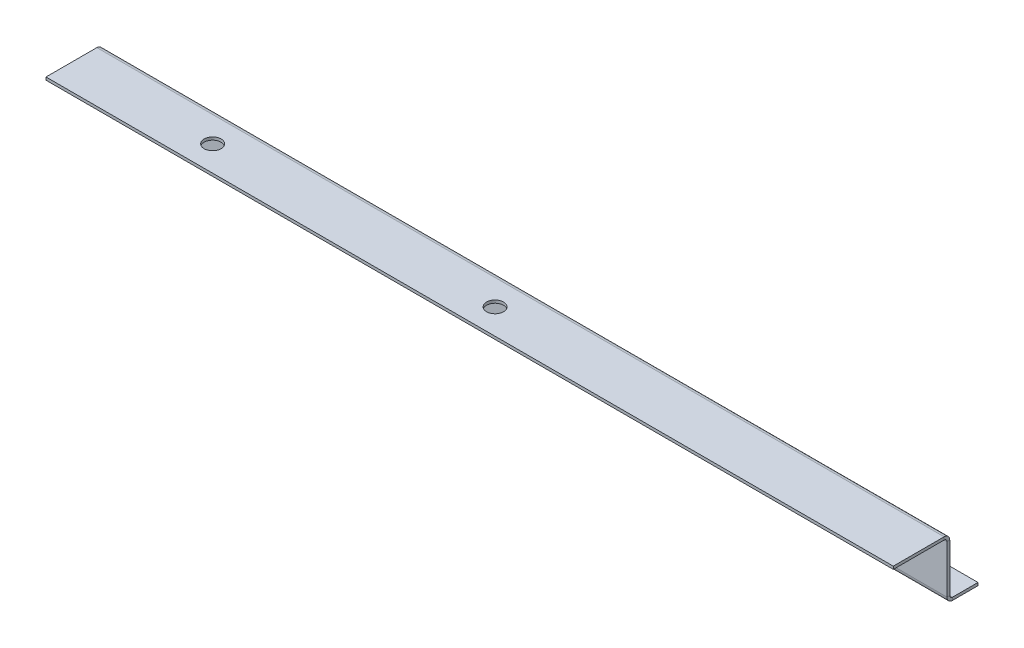
ISO-10303-21;
HEADER;
FILE_DESCRIPTION(('STEP AP214'),'2;1');
FILE_NAME('part.step','',(''),(''),'','','');
FILE_SCHEMA(('AUTOMOTIVE_DESIGN { 1 0 10303 214 1 1 1 1 }'));
ENDSEC;
DATA;
#1=APPLICATION_CONTEXT('core data for automotive mechanical design processes');
#2=APPLICATION_PROTOCOL_DEFINITION('international standard','automotive_design',2000,#1);
#3=PRODUCT_CONTEXT('',#1,'mechanical');
#4=PRODUCT('Part','Part','',(#3));
#5=PRODUCT_RELATED_PRODUCT_CATEGORY('part','',(#4));
#6=PRODUCT_DEFINITION_FORMATION('','',#4);
#7=PRODUCT_DEFINITION_CONTEXT('part definition',#1,'design');
#8=PRODUCT_DEFINITION('design','',#6,#7);
#9=PRODUCT_DEFINITION_SHAPE('','',#8);
#10=(LENGTH_UNIT() NAMED_UNIT(*) SI_UNIT(.MILLI.,.METRE.));
#11=(NAMED_UNIT(*) PLANE_ANGLE_UNIT() SI_UNIT($,.RADIAN.));
#12=(NAMED_UNIT(*) SI_UNIT($,.STERADIAN.) SOLID_ANGLE_UNIT());
#13=UNCERTAINTY_MEASURE_WITH_UNIT(LENGTH_MEASURE(1.E-05),#10,'distance_accuracy_value','');
#14=(GEOMETRIC_REPRESENTATION_CONTEXT(3) GLOBAL_UNCERTAINTY_ASSIGNED_CONTEXT((#13)) GLOBAL_UNIT_ASSIGNED_CONTEXT((#10,
#11,#12)) REPRESENTATION_CONTEXT('',''));
#15=CARTESIAN_POINT('',(0.,0.,0.));
#16=DIRECTION('',(0.,0.,1.));
#17=DIRECTION('',(1.,0.,0.));
#18=AXIS2_PLACEMENT_3D('',#15,#16,#17);
#19=CARTESIAN_POINT('',(300.,-2.,-20.));
#20=DIRECTION('',(1.,0.,0.));
#21=DIRECTION('',(0.,0.,-1.));
#22=AXIS2_PLACEMENT_3D('',#19,#20,#21);
#23=PLANE('',#22);
#24=DIRECTION('',(0.,0.,1.));
#25=VECTOR('',#24,1.);
#26=CARTESIAN_POINT('',(300.,-2.,-20.));
#27=LINE('',#26,#25);
#28=CARTESIAN_POINT('',(300.,-2.,-20.));
#29=VERTEX_POINT('',#28);
#30=CARTESIAN_POINT('',(300.,-2.,-19.));
#31=VERTEX_POINT('',#30);
#32=EDGE_CURVE('E11',#29,#31,#27,.T.);
#33=ORIENTED_EDGE('',*,*,#32,.F.);
#34=CARTESIAN_POINT('',(300.,-2.,-18.));
#35=DIRECTION('',(1.,0.,0.));
#36=DIRECTION('',(0.,0.,-1.));
#37=AXIS2_PLACEMENT_3D('',#34,#35,#36);
#38=CIRCLE('',#37,2.);
#39=CARTESIAN_POINT('',(300.,0.,-18.));
#40=VERTEX_POINT('',#39);
#41=EDGE_CURVE('E270',#40,#29,#38,.F.);
#42=ORIENTED_EDGE('',*,*,#41,.F.);
#43=DIRECTION('',(0.,1.,0.));
#44=VECTOR('',#43,1.);
#45=CARTESIAN_POINT('',(300.,-1.,-18.));
#46=LINE('',#45,#44);
#47=CARTESIAN_POINT('',(300.,-1.,-18.));
#48=VERTEX_POINT('',#47);
#49=EDGE_CURVE('E54',#48,#40,#46,.T.);
#50=ORIENTED_EDGE('',*,*,#49,.F.);
#51=CARTESIAN_POINT('',(300.,-2.,-18.));
#52=DIRECTION('',(1.,0.,0.));
#53=DIRECTION('',(0.,0.,-1.));
#54=AXIS2_PLACEMENT_3D('',#51,#52,#53);
#55=CIRCLE('',#54,1.);
#56=EDGE_CURVE('E156',#48,#31,#55,.F.);
#57=ORIENTED_EDGE('',*,*,#56,.T.);
#58=EDGE_LOOP('',(#33,#42,#50,#57));
#59=FACE_BOUND('',#58,.T.);
#60=ADVANCED_FACE('F45',(#59),#23,.T.);
#61=CARTESIAN_POINT('',(300.,-1.,-18.));
#62=DIRECTION('',(1.,0.,0.));
#63=DIRECTION('',(0.,0.,-1.));
#64=AXIS2_PLACEMENT_3D('',#61,#62,#63);
#65=PLANE('',#64);
#66=DIRECTION('',(0.,-1.,0.));
#67=VECTOR('',#66,1.);
#68=CARTESIAN_POINT('',(300.,0.,-20.));
#69=LINE('',#68,#67);
#70=CARTESIAN_POINT('',(300.,-19.,-20.));
#71=VERTEX_POINT('',#70);
#72=EDGE_CURVE('E150',#29,#71,#69,.T.);
#73=ORIENTED_EDGE('',*,*,#72,.F.);
#74=ORIENTED_EDGE('',*,*,#32,.T.);
#75=DIRECTION('',(0.,1.,0.));
#76=VECTOR('',#75,1.);
#77=CARTESIAN_POINT('',(300.,0.,-19.));
#78=LINE('',#77,#76);
#79=CARTESIAN_POINT('',(300.,-19.,-19.));
#80=VERTEX_POINT('',#79);
#81=EDGE_CURVE('E147',#31,#80,#78,.F.);
#82=ORIENTED_EDGE('',*,*,#81,.T.);
#83=DIRECTION('',(0.,0.,-1.));
#84=VECTOR('',#83,1.);
#85=CARTESIAN_POINT('',(300.,-19.,-19.));
#86=LINE('',#85,#84);
#87=EDGE_CURVE('E239',#80,#71,#86,.T.);
#88=ORIENTED_EDGE('',*,*,#87,.T.);
#89=EDGE_LOOP('',(#73,#74,#82,#88));
#90=FACE_BOUND('',#89,.T.);
#91=ADVANCED_FACE('F145',(#90),#65,.T.);
#92=CARTESIAN_POINT('',(0.,0.,-18.));
#93=DIRECTION('',(-1.,0.,0.));
#94=DIRECTION('',(0.,0.,1.));
#95=AXIS2_PLACEMENT_3D('',#92,#93,#94);
#96=PLANE('',#95);
#97=DIRECTION('',(0.,-1.,0.));
#98=VECTOR('',#97,1.);
#99=CARTESIAN_POINT('',(0.,0.,-18.));
#100=LINE('',#99,#98);
#101=CARTESIAN_POINT('',(0.,0.,-18.));
#102=VERTEX_POINT('',#101);
#103=CARTESIAN_POINT('',(0.,-1.,-18.));
#104=VERTEX_POINT('',#103);
#105=EDGE_CURVE('E244',#102,#104,#100,.T.);
#106=ORIENTED_EDGE('',*,*,#105,.F.);
#107=CARTESIAN_POINT('',(0.,-2.,-18.));
#108=DIRECTION('',(1.,0.,0.));
#109=DIRECTION('',(0.,0.,-1.));
#110=AXIS2_PLACEMENT_3D('',#107,#108,#109);
#111=CIRCLE('',#110,2.);
#112=CARTESIAN_POINT('',(0.,-2.,-20.));
#113=VERTEX_POINT('',#112);
#114=EDGE_CURVE('E196',#102,#113,#111,.F.);
#115=ORIENTED_EDGE('',*,*,#114,.T.);
#116=DIRECTION('',(0.,0.,-1.));
#117=VECTOR('',#116,1.);
#118=CARTESIAN_POINT('',(0.,-2.,-19.));
#119=LINE('',#118,#117);
#120=CARTESIAN_POINT('',(0.,-2.,-19.));
#121=VERTEX_POINT('',#120);
#122=EDGE_CURVE('E242',#121,#113,#119,.T.);
#123=ORIENTED_EDGE('',*,*,#122,.F.);
#124=CARTESIAN_POINT('',(0.,-2.,-18.));
#125=DIRECTION('',(1.,0.,0.));
#126=DIRECTION('',(0.,0.,-1.));
#127=AXIS2_PLACEMENT_3D('',#124,#125,#126);
#128=CIRCLE('',#127,1.);
#129=EDGE_CURVE('E168',#104,#121,#128,.F.);
#130=ORIENTED_EDGE('',*,*,#129,.F.);
#131=EDGE_LOOP('',(#106,#115,#123,#130));
#132=FACE_BOUND('',#131,.T.);
#133=ADVANCED_FACE('F288',(#132),#96,.T.);
#134=CARTESIAN_POINT('',(0.,-2.,-19.));
#135=DIRECTION('',(-1.,0.,0.));
#136=DIRECTION('',(0.,0.,1.));
#137=AXIS2_PLACEMENT_3D('',#134,#135,#136);
#138=PLANE('',#137);
#139=DIRECTION('',(0.,0.,-1.));
#140=VECTOR('',#139,1.);
#141=CARTESIAN_POINT('',(0.,0.,0.));
#142=LINE('',#141,#140);
#143=CARTESIAN_POINT('',(0.,0.,0.));
#144=VERTEX_POINT('',#143);
#145=EDGE_CURVE('E199',#144,#102,#142,.T.);
#146=ORIENTED_EDGE('',*,*,#145,.T.);
#147=ORIENTED_EDGE('',*,*,#105,.T.);
#148=DIRECTION('',(0.,0.,-1.));
#149=VECTOR('',#148,1.);
#150=CARTESIAN_POINT('',(0.,-1.,0.));
#151=LINE('',#150,#149);
#152=CARTESIAN_POINT('',(0.,-1.,0.));
#153=VERTEX_POINT('',#152);
#154=EDGE_CURVE('E205',#153,#104,#151,.T.);
#155=ORIENTED_EDGE('',*,*,#154,.F.);
#156=DIRECTION('',(0.,1.,0.));
#157=VECTOR('',#156,1.);
#158=CARTESIAN_POINT('',(0.,-1.,0.));
#159=LINE('',#158,#157);
#160=EDGE_CURVE('E202',#153,#144,#159,.T.);
#161=ORIENTED_EDGE('',*,*,#160,.T.);
#162=EDGE_LOOP('',(#146,#147,#155,#161));
#163=FACE_BOUND('',#162,.T.);
#164=ADVANCED_FACE('F333',(#163),#138,.T.);
#165=CARTESIAN_POINT('',(300.,-20.,-21.));
#166=DIRECTION('',(1.,0.,0.));
#167=DIRECTION('',(0.,0.,-1.));
#168=AXIS2_PLACEMENT_3D('',#165,#166,#167);
#169=PLANE('',#168);
#170=DIRECTION('',(0.,-1.,0.));
#171=VECTOR('',#170,1.);
#172=CARTESIAN_POINT('',(300.,-20.,-21.));
#173=LINE('',#172,#171);
#174=CARTESIAN_POINT('',(300.,-20.,-21.));
#175=VERTEX_POINT('',#174);
#176=CARTESIAN_POINT('',(300.,-21.,-21.));
#177=VERTEX_POINT('',#176);
#178=EDGE_CURVE('E63',#175,#177,#173,.T.);
#179=ORIENTED_EDGE('',*,*,#178,.F.);
#180=CARTESIAN_POINT('',(300.,-19.,-21.));
#181=DIRECTION('',(-1.,0.,0.));
#182=DIRECTION('',(0.,0.,1.));
#183=AXIS2_PLACEMENT_3D('',#180,#181,#182);
#184=CIRCLE('',#183,1.);
#185=EDGE_CURVE('E266',#71,#175,#184,.F.);
#186=ORIENTED_EDGE('',*,*,#185,.F.);
#187=ORIENTED_EDGE('',*,*,#87,.F.);
#188=CARTESIAN_POINT('',(300.,-19.,-21.));
#189=DIRECTION('',(1.,0.,0.));
#190=DIRECTION('',(0.,0.,-1.));
#191=AXIS2_PLACEMENT_3D('',#188,#189,#190);
#192=CIRCLE('',#191,2.);
#193=EDGE_CURVE('E176',#80,#177,#192,.T.);
#194=ORIENTED_EDGE('',*,*,#193,.T.);
#195=EDGE_LOOP('',(#179,#186,#187,#194));
#196=FACE_BOUND('',#195,.T.);
#197=ADVANCED_FACE('F338',(#196),#169,.T.);
#198=CARTESIAN_POINT('',(300.,-19.,-19.));
#199=DIRECTION('',(1.,0.,0.));
#200=DIRECTION('',(0.,0.,-1.));
#201=AXIS2_PLACEMENT_3D('',#198,#199,#200);
#202=PLANE('',#201);
#203=DIRECTION('',(0.,0.,-1.));
#204=VECTOR('',#203,1.);
#205=CARTESIAN_POINT('',(300.,-20.,-20.));
#206=LINE('',#205,#204);
#207=CARTESIAN_POINT('',(300.,-20.,-30.));
#208=VERTEX_POINT('',#207);
#209=EDGE_CURVE('E263',#175,#208,#206,.T.);
#210=ORIENTED_EDGE('',*,*,#209,.F.);
#211=ORIENTED_EDGE('',*,*,#178,.T.);
#212=DIRECTION('',(0.,0.,-1.));
#213=VECTOR('',#212,1.);
#214=CARTESIAN_POINT('',(300.,-21.,-20.));
#215=LINE('',#214,#213);
#216=CARTESIAN_POINT('',(300.,-21.,-30.));
#217=VERTEX_POINT('',#216);
#218=EDGE_CURVE('E117',#177,#217,#215,.T.);
#219=ORIENTED_EDGE('',*,*,#218,.T.);
#220=DIRECTION('',(0.,-1.,0.));
#221=VECTOR('',#220,1.);
#222=CARTESIAN_POINT('',(300.,-20.,-30.));
#223=LINE('',#222,#221);
#224=EDGE_CURVE('E260',#208,#217,#223,.T.);
#225=ORIENTED_EDGE('',*,*,#224,.F.);
#226=EDGE_LOOP('',(#210,#211,#219,#225));
#227=FACE_BOUND('',#226,.T.);
#228=ADVANCED_FACE('F315',(#227),#202,.T.);
#229=CARTESIAN_POINT('',(0.,-19.,-20.));
#230=DIRECTION('',(-1.,0.,0.));
#231=DIRECTION('',(0.,0.,1.));
#232=AXIS2_PLACEMENT_3D('',#229,#230,#231);
#233=PLANE('',#232);
#234=DIRECTION('',(0.,0.,1.));
#235=VECTOR('',#234,1.);
#236=CARTESIAN_POINT('',(0.,-19.,-20.));
#237=LINE('',#236,#235);
#238=CARTESIAN_POINT('',(0.,-19.,-20.));
#239=VERTEX_POINT('',#238);
#240=CARTESIAN_POINT('',(0.,-19.,-19.));
#241=VERTEX_POINT('',#240);
#242=EDGE_CURVE('E104',#239,#241,#237,.T.);
#243=ORIENTED_EDGE('',*,*,#242,.F.);
#244=CARTESIAN_POINT('',(0.,-19.,-21.));
#245=DIRECTION('',(-1.,0.,0.));
#246=DIRECTION('',(0.,0.,1.));
#247=AXIS2_PLACEMENT_3D('',#244,#245,#246);
#248=CIRCLE('',#247,1.);
#249=CARTESIAN_POINT('',(0.,-20.,-21.));
#250=VERTEX_POINT('',#249);
#251=EDGE_CURVE('E192',#239,#250,#248,.F.);
#252=ORIENTED_EDGE('',*,*,#251,.T.);
#253=DIRECTION('',(0.,1.,0.));
#254=VECTOR('',#253,1.);
#255=CARTESIAN_POINT('',(0.,-21.,-21.));
#256=LINE('',#255,#254);
#257=CARTESIAN_POINT('',(0.,-21.,-21.));
#258=VERTEX_POINT('',#257);
#259=EDGE_CURVE('E111',#258,#250,#256,.T.);
#260=ORIENTED_EDGE('',*,*,#259,.F.);
#261=CARTESIAN_POINT('',(0.,-19.,-21.));
#262=DIRECTION('',(1.,0.,0.));
#263=DIRECTION('',(0.,0.,-1.));
#264=AXIS2_PLACEMENT_3D('',#261,#262,#263);
#265=CIRCLE('',#264,2.);
#266=EDGE_CURVE('E211',#241,#258,#265,.T.);
#267=ORIENTED_EDGE('',*,*,#266,.F.);
#268=EDGE_LOOP('',(#243,#252,#260,#267));
#269=FACE_BOUND('',#268,.T.);
#270=ADVANCED_FACE('F303',(#269),#233,.T.);
#271=CARTESIAN_POINT('',(0.,-21.,-21.));
#272=DIRECTION('',(-1.,0.,0.));
#273=DIRECTION('',(0.,0.,1.));
#274=AXIS2_PLACEMENT_3D('',#271,#272,#273);
#275=PLANE('',#274);
#276=DIRECTION('',(0.,-1.,0.));
#277=VECTOR('',#276,1.);
#278=CARTESIAN_POINT('',(0.,0.,-20.));
#279=LINE('',#278,#277);
#280=EDGE_CURVE('E194',#113,#239,#279,.T.);
#281=ORIENTED_EDGE('',*,*,#280,.T.);
#282=ORIENTED_EDGE('',*,*,#242,.T.);
#283=DIRECTION('',(0.,1.,0.));
#284=VECTOR('',#283,1.);
#285=CARTESIAN_POINT('',(0.,0.,-19.));
#286=LINE('',#285,#284);
#287=EDGE_CURVE('E209',#121,#241,#286,.F.);
#288=ORIENTED_EDGE('',*,*,#287,.F.);
#289=ORIENTED_EDGE('',*,*,#122,.T.);
#290=EDGE_LOOP('',(#281,#282,#288,#289));
#291=FACE_BOUND('',#290,.T.);
#292=ADVANCED_FACE('F290',(#291),#275,.T.);
#293=CARTESIAN_POINT('',(300.,-21.,-20.));
#294=DIRECTION('',(0.,1.,0.));
#295=DIRECTION('',(0.,0.,1.));
#296=AXIS2_PLACEMENT_3D('',#293,#294,#295);
#297=PLANE('',#296);
#298=DIRECTION('',(0.,0.,-1.));
#299=VECTOR('',#298,1.);
#300=CARTESIAN_POINT('',(0.,-21.,-20.));
#301=LINE('',#300,#299);
#302=CARTESIAN_POINT('',(0.,-21.,-30.));
#303=VERTEX_POINT('',#302);
#304=EDGE_CURVE('E182',#258,#303,#301,.T.);
#305=ORIENTED_EDGE('',*,*,#304,.T.);
#306=DIRECTION('',(-1.,0.,0.));
#307=VECTOR('',#306,1.);
#308=CARTESIAN_POINT('',(300.,-21.,-30.));
#309=LINE('',#308,#307);
#310=EDGE_CURVE('E235',#217,#303,#309,.T.);
#311=ORIENTED_EDGE('',*,*,#310,.F.);
#312=ORIENTED_EDGE('',*,*,#218,.F.);
#313=DIRECTION('',(-1.,0.,0.));
#314=VECTOR('',#313,1.);
#315=CARTESIAN_POINT('',(300.,-21.,-21.));
#316=LINE('',#315,#314);
#317=EDGE_CURVE('E178',#177,#258,#316,.T.);
#318=ORIENTED_EDGE('',*,*,#317,.T.);
#319=EDGE_LOOP('',(#305,#311,#312,#318));
#320=FACE_BOUND('',#319,.T.);
#321=ADVANCED_FACE('F309',(#320),#297,.F.);
#322=CARTESIAN_POINT('',(300.,-20.,-30.));
#323=DIRECTION('',(0.,0.,-1.));
#324=DIRECTION('',(-1.,0.,0.));
#325=AXIS2_PLACEMENT_3D('',#322,#323,#324);
#326=PLANE('',#325);
#327=DIRECTION('',(0.,-1.,0.));
#328=VECTOR('',#327,1.);
#329=CARTESIAN_POINT('',(0.,-20.,-30.));
#330=LINE('',#329,#328);
#331=CARTESIAN_POINT('',(0.,-20.,-30.));
#332=VERTEX_POINT('',#331);
#333=EDGE_CURVE('E185',#332,#303,#330,.T.);
#334=ORIENTED_EDGE('',*,*,#333,.F.);
#335=DIRECTION('',(-1.,0.,0.));
#336=VECTOR('',#335,1.);
#337=CARTESIAN_POINT('',(300.,-20.,-30.));
#338=LINE('',#337,#336);
#339=EDGE_CURVE('E233',#208,#332,#338,.T.);
#340=ORIENTED_EDGE('',*,*,#339,.F.);
#341=ORIENTED_EDGE('',*,*,#224,.T.);
#342=ORIENTED_EDGE('',*,*,#310,.T.);
#343=EDGE_LOOP('',(#334,#340,#341,#342));
#344=FACE_BOUND('',#343,.T.);
#345=ADVANCED_FACE('F314',(#344),#326,.T.);
#346=CARTESIAN_POINT('',(300.,-20.,-20.));
#347=DIRECTION('',(0.,1.,0.));
#348=DIRECTION('',(0.,0.,1.));
#349=AXIS2_PLACEMENT_3D('',#346,#347,#348);
#350=PLANE('',#349);
#351=DIRECTION('',(0.,0.,-1.));
#352=VECTOR('',#351,1.);
#353=CARTESIAN_POINT('',(0.,-20.,-20.));
#354=LINE('',#353,#352);
#355=EDGE_CURVE('E189',#250,#332,#354,.T.);
#356=ORIENTED_EDGE('',*,*,#355,.F.);
#357=DIRECTION('',(-1.,0.,0.));
#358=VECTOR('',#357,1.);
#359=CARTESIAN_POINT('',(300.,-20.,-21.));
#360=LINE('',#359,#358);
#361=EDGE_CURVE('E230',#175,#250,#360,.T.);
#362=ORIENTED_EDGE('',*,*,#361,.F.);
#363=ORIENTED_EDGE('',*,*,#209,.T.);
#364=ORIENTED_EDGE('',*,*,#339,.T.);
#365=EDGE_LOOP('',(#356,#362,#363,#364));
#366=FACE_BOUND('',#365,.T.);
#367=ADVANCED_FACE('F317',(#366),#350,.T.);
#368=CARTESIAN_POINT('',(300.,-19.,-21.));
#369=DIRECTION('',(-1.,0.,0.));
#370=DIRECTION('',(0.,0.,1.));
#371=AXIS2_PLACEMENT_3D('',#368,#369,#370);
#372=CYLINDRICAL_SURFACE('',#371,1.);
#373=ORIENTED_EDGE('',*,*,#251,.F.);
#374=DIRECTION('',(-1.,0.,0.));
#375=VECTOR('',#374,1.);
#376=CARTESIAN_POINT('',(300.,-19.,-20.));
#377=LINE('',#376,#375);
#378=EDGE_CURVE('E227',#71,#239,#377,.T.);
#379=ORIENTED_EDGE('',*,*,#378,.F.);
#380=ORIENTED_EDGE('',*,*,#185,.T.);
#381=ORIENTED_EDGE('',*,*,#361,.T.);
#382=EDGE_LOOP('',(#373,#379,#380,#381));
#383=FACE_BOUND('',#382,.T.);
#384=ADVANCED_FACE('F300',(#383),#372,.F.);
#385=CARTESIAN_POINT('',(300.,0.,-20.));
#386=DIRECTION('',(0.,0.,-1.));
#387=DIRECTION('',(-1.,0.,0.));
#388=AXIS2_PLACEMENT_3D('',#385,#386,#387);
#389=PLANE('',#388);
#390=ORIENTED_EDGE('',*,*,#280,.F.);
#391=DIRECTION('',(-1.,0.,0.));
#392=VECTOR('',#391,1.);
#393=CARTESIAN_POINT('',(300.,-2.,-20.));
#394=LINE('',#393,#392);
#395=EDGE_CURVE('E224',#29,#113,#394,.T.);
#396=ORIENTED_EDGE('',*,*,#395,.F.);
#397=ORIENTED_EDGE('',*,*,#72,.T.);
#398=ORIENTED_EDGE('',*,*,#378,.T.);
#399=EDGE_LOOP('',(#390,#396,#397,#398));
#400=FACE_BOUND('',#399,.T.);
#401=ADVANCED_FACE('F295',(#400),#389,.T.);
#402=CARTESIAN_POINT('',(300.,-2.,-18.));
#403=DIRECTION('',(-1.,0.,0.));
#404=DIRECTION('',(0.,0.,1.));
#405=AXIS2_PLACEMENT_3D('',#402,#403,#404);
#406=CYLINDRICAL_SURFACE('',#405,2.);
#407=ORIENTED_EDGE('',*,*,#114,.F.);
#408=DIRECTION('',(-1.,0.,0.));
#409=VECTOR('',#408,1.);
#410=CARTESIAN_POINT('',(300.,0.,-18.));
#411=LINE('',#410,#409);
#412=EDGE_CURVE('E221',#40,#102,#411,.T.);
#413=ORIENTED_EDGE('',*,*,#412,.F.);
#414=ORIENTED_EDGE('',*,*,#41,.T.);
#415=ORIENTED_EDGE('',*,*,#395,.T.);
#416=EDGE_LOOP('',(#407,#413,#414,#415));
#417=FACE_BOUND('',#416,.T.);
#418=ADVANCED_FACE('F293',(#417),#406,.T.);
#419=CARTESIAN_POINT('',(300.,0.,0.));
#420=DIRECTION('',(0.,1.,0.));
#421=DIRECTION('',(0.,0.,1.));
#422=AXIS2_PLACEMENT_3D('',#419,#420,#421);
#423=PLANE('',#422);
#424=CARTESIAN_POINT('',(50.,0.,-9.));
#425=DIRECTION('',(0.,1.,0.));
#426=DIRECTION('',(0.,0.,1.));
#427=AXIS2_PLACEMENT_3D('',#424,#425,#426);
#428=CIRCLE('',#427,3.);
#429=CARTESIAN_POINT('',(50.,0.,-6.));
#430=VERTEX_POINT('',#429);
#431=EDGE_CURVE('E186',#430,#430,#428,.T.);
#432=ORIENTED_EDGE('',*,*,#431,.F.);
#433=EDGE_LOOP('',(#432));
#434=FACE_BOUND('',#433,.T.);
#435=CARTESIAN_POINT('',(150.,0.,-9.));
#436=DIRECTION('',(0.,1.,0.));
#437=DIRECTION('',(0.,0.,1.));
#438=AXIS2_PLACEMENT_3D('',#435,#436,#437);
#439=CIRCLE('',#438,2.99999999999999);
#440=CARTESIAN_POINT('',(150.,0.,-6.00000000000001));
#441=VERTEX_POINT('',#440);
#442=EDGE_CURVE('E248',#441,#441,#439,.T.);
#443=ORIENTED_EDGE('',*,*,#442,.F.);
#444=EDGE_LOOP('',(#443));
#445=FACE_BOUND('',#444,.T.);
#446=ORIENTED_EDGE('',*,*,#145,.F.);
#447=DIRECTION('',(-1.,0.,0.));
#448=VECTOR('',#447,1.);
#449=CARTESIAN_POINT('',(300.,0.,0.));
#450=LINE('',#449,#448);
#451=CARTESIAN_POINT('',(300.,0.,0.));
#452=VERTEX_POINT('',#451);
#453=EDGE_CURVE('E219',#452,#144,#450,.T.);
#454=ORIENTED_EDGE('',*,*,#453,.F.);
#455=DIRECTION('',(0.,0.,-1.));
#456=VECTOR('',#455,1.);
#457=CARTESIAN_POINT('',(300.,0.,0.));
#458=LINE('',#457,#456);
#459=EDGE_CURVE('E272',#452,#40,#458,.T.);
#460=ORIENTED_EDGE('',*,*,#459,.T.);
#461=ORIENTED_EDGE('',*,*,#412,.T.);
#462=EDGE_LOOP('',(#446,#454,#460,#461));
#463=FACE_BOUND('',#462,.T.);
#464=ADVANCED_FACE('F391',(#434,#445,#463),#423,.T.);
#465=CARTESIAN_POINT('',(300.,-1.,0.));
#466=DIRECTION('',(0.,0.,1.));
#467=DIRECTION('',(1.,0.,0.));
#468=AXIS2_PLACEMENT_3D('',#465,#466,#467);
#469=PLANE('',#468);
#470=ORIENTED_EDGE('',*,*,#160,.F.);
#471=DIRECTION('',(-1.,0.,0.));
#472=VECTOR('',#471,1.);
#473=CARTESIAN_POINT('',(300.,-1.,0.));
#474=LINE('',#473,#472);
#475=CARTESIAN_POINT('',(300.,-1.,0.));
#476=VERTEX_POINT('',#475);
#477=EDGE_CURVE('E217',#476,#153,#474,.T.);
#478=ORIENTED_EDGE('',*,*,#477,.F.);
#479=DIRECTION('',(0.,1.,0.));
#480=VECTOR('',#479,1.);
#481=CARTESIAN_POINT('',(300.,-1.,0.));
#482=LINE('',#481,#480);
#483=EDGE_CURVE('E275',#476,#452,#482,.T.);
#484=ORIENTED_EDGE('',*,*,#483,.T.);
#485=ORIENTED_EDGE('',*,*,#453,.T.);
#486=EDGE_LOOP('',(#470,#478,#484,#485));
#487=FACE_BOUND('',#486,.T.);
#488=ADVANCED_FACE('F402',(#487),#469,.T.);
#489=CARTESIAN_POINT('',(300.,-1.,0.));
#490=DIRECTION('',(0.,1.,0.));
#491=DIRECTION('',(0.,0.,1.));
#492=AXIS2_PLACEMENT_3D('',#489,#490,#491);
#493=PLANE('',#492);
#494=CARTESIAN_POINT('',(50.,-1.,-9.));
#495=DIRECTION('',(0.,1.,0.));
#496=DIRECTION('',(0.,0.,1.));
#497=AXIS2_PLACEMENT_3D('',#494,#495,#496);
#498=CIRCLE('',#497,3.);
#499=CARTESIAN_POINT('',(50.,-1.,-6.));
#500=VERTEX_POINT('',#499);
#501=EDGE_CURVE('E48',#500,#500,#498,.T.);
#502=ORIENTED_EDGE('',*,*,#501,.T.);
#503=EDGE_LOOP('',(#502));
#504=FACE_BOUND('',#503,.T.);
#505=CARTESIAN_POINT('',(150.,-1.,-9.));
#506=DIRECTION('',(0.,1.,0.));
#507=DIRECTION('',(0.,0.,1.));
#508=AXIS2_PLACEMENT_3D('',#505,#506,#507);
#509=CIRCLE('',#508,2.99999999999999);
#510=CARTESIAN_POINT('',(150.,-1.,-6.00000000000001));
#511=VERTEX_POINT('',#510);
#512=EDGE_CURVE('E246',#511,#511,#509,.T.);
#513=ORIENTED_EDGE('',*,*,#512,.T.);
#514=EDGE_LOOP('',(#513));
#515=FACE_BOUND('',#514,.T.);
#516=ORIENTED_EDGE('',*,*,#154,.T.);
#517=DIRECTION('',(-1.,0.,0.));
#518=VECTOR('',#517,1.);
#519=CARTESIAN_POINT('',(300.,-1.,-18.));
#520=LINE('',#519,#518);
#521=EDGE_CURVE('E170',#48,#104,#520,.T.);
#522=ORIENTED_EDGE('',*,*,#521,.F.);
#523=DIRECTION('',(0.,0.,-1.));
#524=VECTOR('',#523,1.);
#525=CARTESIAN_POINT('',(300.,-1.,0.));
#526=LINE('',#525,#524);
#527=EDGE_CURVE('E161',#476,#48,#526,.T.);
#528=ORIENTED_EDGE('',*,*,#527,.F.);
#529=ORIENTED_EDGE('',*,*,#477,.T.);
#530=EDGE_LOOP('',(#516,#522,#528,#529));
#531=FACE_BOUND('',#530,.T.);
#532=ADVANCED_FACE('F285',(#504,#515,#531),#493,.F.);
#533=CARTESIAN_POINT('',(300.,-2.,-18.));
#534=DIRECTION('',(-1.,0.,0.));
#535=DIRECTION('',(0.,0.,1.));
#536=AXIS2_PLACEMENT_3D('',#533,#534,#535);
#537=CYLINDRICAL_SURFACE('',#536,1.);
#538=ORIENTED_EDGE('',*,*,#129,.T.);
#539=DIRECTION('',(-1.,0.,0.));
#540=VECTOR('',#539,1.);
#541=CARTESIAN_POINT('',(300.,-2.,-19.));
#542=LINE('',#541,#540);
#543=EDGE_CURVE('E165',#31,#121,#542,.T.);
#544=ORIENTED_EDGE('',*,*,#543,.F.);
#545=ORIENTED_EDGE('',*,*,#56,.F.);
#546=ORIENTED_EDGE('',*,*,#521,.T.);
#547=EDGE_LOOP('',(#538,#544,#545,#546));
#548=FACE_BOUND('',#547,.T.);
#549=ADVANCED_FACE('F166',(#548),#537,.F.);
#550=CARTESIAN_POINT('',(300.,0.,-19.));
#551=DIRECTION('',(0.,0.,-1.));
#552=DIRECTION('',(-1.,0.,0.));
#553=AXIS2_PLACEMENT_3D('',#550,#551,#552);
#554=PLANE('',#553);
#555=ORIENTED_EDGE('',*,*,#287,.T.);
#556=DIRECTION('',(-1.,0.,0.));
#557=VECTOR('',#556,1.);
#558=CARTESIAN_POINT('',(300.,-19.,-19.));
#559=LINE('',#558,#557);
#560=EDGE_CURVE('E171',#80,#241,#559,.T.);
#561=ORIENTED_EDGE('',*,*,#560,.F.);
#562=ORIENTED_EDGE('',*,*,#81,.F.);
#563=ORIENTED_EDGE('',*,*,#543,.T.);
#564=EDGE_LOOP('',(#555,#561,#562,#563));
#565=FACE_BOUND('',#564,.T.);
#566=ADVANCED_FACE('F173',(#565),#554,.F.);
#567=CARTESIAN_POINT('',(300.,-19.,-21.));
#568=DIRECTION('',(-1.,0.,0.));
#569=DIRECTION('',(0.,0.,1.));
#570=AXIS2_PLACEMENT_3D('',#567,#568,#569);
#571=CYLINDRICAL_SURFACE('',#570,2.);
#572=ORIENTED_EDGE('',*,*,#266,.T.);
#573=ORIENTED_EDGE('',*,*,#317,.F.);
#574=ORIENTED_EDGE('',*,*,#193,.F.);
#575=ORIENTED_EDGE('',*,*,#560,.T.);
#576=EDGE_LOOP('',(#572,#573,#574,#575));
#577=FACE_BOUND('',#576,.T.);
#578=ADVANCED_FACE('F306',(#577),#571,.T.);
#579=CARTESIAN_POINT('',(300.,-19.,-21.));
#580=DIRECTION('',(-1.,0.,0.));
#581=DIRECTION('',(0.,0.,1.));
#582=AXIS2_PLACEMENT_3D('',#579,#580,#581);
#583=PLANE('',#582);
#584=ORIENTED_EDGE('',*,*,#527,.T.);
#585=ORIENTED_EDGE('',*,*,#49,.T.);
#586=ORIENTED_EDGE('',*,*,#459,.F.);
#587=ORIENTED_EDGE('',*,*,#483,.F.);
#588=EDGE_LOOP('',(#584,#585,#586,#587));
#589=FACE_BOUND('',#588,.T.);
#590=ADVANCED_FACE('F281',(#589),#583,.F.);
#591=CARTESIAN_POINT('',(0.,-19.,-21.));
#592=DIRECTION('',(-1.,0.,0.));
#593=DIRECTION('',(0.,0.,1.));
#594=AXIS2_PLACEMENT_3D('',#591,#592,#593);
#595=PLANE('',#594);
#596=ORIENTED_EDGE('',*,*,#304,.F.);
#597=ORIENTED_EDGE('',*,*,#259,.T.);
#598=ORIENTED_EDGE('',*,*,#355,.T.);
#599=ORIENTED_EDGE('',*,*,#333,.T.);
#600=EDGE_LOOP('',(#596,#597,#598,#599));
#601=FACE_BOUND('',#600,.T.);
#602=ADVANCED_FACE('F311',(#601),#595,.T.);
#603=CARTESIAN_POINT('',(150.,-21.,-9.));
#604=DIRECTION('',(0.,1.,0.));
#605=DIRECTION('',(0.,0.,1.));
#606=AXIS2_PLACEMENT_3D('',#603,#604,#605);
#607=CYLINDRICAL_SURFACE('',#606,2.99999999999999);
#608=CARTESIAN_POINT('',(150.,0.,-6.00000000000001));
#609=CARTESIAN_POINT('',(150.,-0.0104166666666667,-6.00000000000001));
#610=CARTESIAN_POINT('',(150.,-0.0208333333333333,-6.00000000000001));
#611=CARTESIAN_POINT('',(150.,-0.0416666666666667,-6.00000000000001));
#612=CARTESIAN_POINT('',(150.,-0.0520833333333334,-6.00000000000001));
#613=CARTESIAN_POINT('',(150.,-0.0729166666666667,-6.00000000000001));
#614=CARTESIAN_POINT('',(150.,-0.0833333333333334,-6.00000000000001));
#615=CARTESIAN_POINT('',(150.,-0.104166666666667,-6.00000000000001));
#616=CARTESIAN_POINT('',(150.,-0.114583333333333,-6.00000000000001));
#617=CARTESIAN_POINT('',(150.,-0.135416666666667,-6.00000000000001));
#618=CARTESIAN_POINT('',(150.,-0.145833333333333,-6.00000000000001));
#619=CARTESIAN_POINT('',(150.,-0.166666666666667,-6.00000000000001));
#620=CARTESIAN_POINT('',(150.,-0.177083333333333,-6.00000000000001));
#621=CARTESIAN_POINT('',(150.,-0.197916666666667,-6.00000000000001));
#622=CARTESIAN_POINT('',(150.,-0.208333333333334,-6.00000000000001));
#623=CARTESIAN_POINT('',(150.,-0.229166666666667,-6.00000000000001));
#624=CARTESIAN_POINT('',(150.,-0.239583333333334,-6.00000000000001));
#625=CARTESIAN_POINT('',(150.,-0.260416666666667,-6.00000000000001));
#626=CARTESIAN_POINT('',(150.,-0.270833333333334,-6.00000000000001));
#627=CARTESIAN_POINT('',(150.,-0.291666666666667,-6.00000000000001));
#628=CARTESIAN_POINT('',(150.,-0.302083333333334,-6.00000000000001));
#629=CARTESIAN_POINT('',(150.,-0.322916666666667,-6.00000000000001));
#630=CARTESIAN_POINT('',(150.,-0.333333333333334,-6.00000000000001));
#631=CARTESIAN_POINT('',(150.,-0.354166666666667,-6.00000000000001));
#632=CARTESIAN_POINT('',(150.,-0.364583333333334,-6.00000000000001));
#633=CARTESIAN_POINT('',(150.,-0.385416666666667,-6.00000000000001));
#634=CARTESIAN_POINT('',(150.,-0.395833333333334,-6.00000000000001));
#635=CARTESIAN_POINT('',(150.,-0.416666666666667,-6.00000000000001));
#636=CARTESIAN_POINT('',(150.,-0.427083333333334,-6.00000000000001));
#637=CARTESIAN_POINT('',(150.,-0.447916666666667,-6.00000000000001));
#638=CARTESIAN_POINT('',(150.,-0.458333333333334,-6.00000000000001));
#639=CARTESIAN_POINT('',(150.,-0.479166666666667,-6.00000000000001));
#640=CARTESIAN_POINT('',(150.,-0.489583333333334,-6.00000000000001));
#641=CARTESIAN_POINT('',(150.,-0.510416666666667,-6.00000000000001));
#642=CARTESIAN_POINT('',(150.,-0.520833333333334,-6.00000000000001));
#643=CARTESIAN_POINT('',(150.,-0.541666666666667,-6.00000000000001));
#644=CARTESIAN_POINT('',(150.,-0.552083333333334,-6.00000000000001));
#645=CARTESIAN_POINT('',(150.,-0.572916666666667,-6.00000000000001));
#646=CARTESIAN_POINT('',(150.,-0.583333333333334,-6.00000000000001));
#647=CARTESIAN_POINT('',(150.,-0.604166666666667,-6.00000000000001));
#648=CARTESIAN_POINT('',(150.,-0.614583333333334,-6.00000000000001));
#649=CARTESIAN_POINT('',(150.,-0.635416666666667,-6.00000000000001));
#650=CARTESIAN_POINT('',(150.,-0.645833333333334,-6.00000000000001));
#651=CARTESIAN_POINT('',(150.,-0.666666666666667,-6.00000000000001));
#652=CARTESIAN_POINT('',(150.,-0.677083333333334,-6.00000000000001));
#653=CARTESIAN_POINT('',(150.,-0.697916666666667,-6.00000000000001));
#654=CARTESIAN_POINT('',(150.,-0.708333333333334,-6.00000000000001));
#655=CARTESIAN_POINT('',(150.,-0.729166666666667,-6.00000000000001));
#656=CARTESIAN_POINT('',(150.,-0.739583333333334,-6.00000000000001));
#657=CARTESIAN_POINT('',(150.,-0.760416666666667,-6.00000000000001));
#658=CARTESIAN_POINT('',(150.,-0.770833333333334,-6.00000000000001));
#659=CARTESIAN_POINT('',(150.,-0.791666666666667,-6.00000000000001));
#660=CARTESIAN_POINT('',(150.,-0.802083333333334,-6.00000000000001));
#661=CARTESIAN_POINT('',(150.,-0.822916666666667,-6.00000000000001));
#662=CARTESIAN_POINT('',(150.,-0.833333333333334,-6.00000000000001));
#663=CARTESIAN_POINT('',(150.,-0.854166666666667,-6.00000000000001));
#664=CARTESIAN_POINT('',(150.,-0.864583333333334,-6.00000000000001));
#665=CARTESIAN_POINT('',(150.,-0.885416666666668,-6.00000000000001));
#666=CARTESIAN_POINT('',(150.,-0.895833333333334,-6.00000000000001));
#667=CARTESIAN_POINT('',(150.,-0.916666666666668,-6.00000000000001));
#668=CARTESIAN_POINT('',(150.,-0.927083333333334,-6.00000000000001));
#669=CARTESIAN_POINT('',(150.,-0.947916666666668,-6.00000000000001));
#670=CARTESIAN_POINT('',(150.,-0.958333333333334,-6.00000000000001));
#671=CARTESIAN_POINT('',(150.,-0.979166666666668,-6.00000000000001));
#672=CARTESIAN_POINT('',(150.,-0.989583333333334,-6.00000000000001));
#673=CARTESIAN_POINT('',(150.,-1.,-6.00000000000001));
#674=B_SPLINE_CURVE_WITH_KNOTS('',3,(#608,#609,#610,#611,#612,#613,#614,#615,#616,#617,#618,
#619,#620,#621,#622,#623,#624,#625,#626,#627,#628,#629,#630,#631,#632,#633,#634,#635,#636,#637,
#638,#639,#640,#641,#642,#643,#644,#645,#646,#647,#648,#649,#650,#651,#652,#653,#654,#655,#656,
#657,#658,#659,#660,#661,#662,#663,#664,#665,#666,#667,#668,#669,#670,#671,#672,#673),
.UNSPECIFIED.,.F.,.F.,(4,2,2,2,2,2,2,2,2,2,2,2,2,2,2,2,2,2,2,2,2,2,2,2,2,2,2,2,2,2,2,2,4),(0.,
0.03125,0.0625000000000001,0.0937500000000001,0.125,0.15625,0.1875,0.21875,0.25,0.28125,0.3125,
0.34375,0.375,0.40625,0.4375,0.46875,0.5,0.53125,0.5625,0.593750000000001,0.625000000000001,
0.656250000000001,0.687500000000001,0.718750000000001,0.750000000000001,0.781250000000001,
0.812500000000001,0.843750000000001,0.875000000000001,0.906250000000001,0.937500000000001,
0.968750000000001,1.),.UNSPECIFIED.);
#675=EDGE_CURVE('BSEAM469',#441,#511,#674,.T.);
#676=ORIENTED_EDGE('',*,*,#442,.T.);
#677=ORIENTED_EDGE('',*,*,#512,.F.);
#678=ORIENTED_EDGE('',*,*,#675,.T.);
#679=ORIENTED_EDGE('',*,*,#675,.F.);
#680=EDGE_LOOP('',(#676,#678,#677,#679));
#681=FACE_BOUND('',#680,.T.);
#682=ADVANCED_FACE('F469',(#681),#607,.F.);
#683=CARTESIAN_POINT('',(50.,-21.,-9.));
#684=DIRECTION('',(0.,1.,0.));
#685=DIRECTION('',(0.,0.,1.));
#686=AXIS2_PLACEMENT_3D('',#683,#684,#685);
#687=CYLINDRICAL_SURFACE('',#686,3.);
#688=CARTESIAN_POINT('',(50.,0.,-6.));
#689=CARTESIAN_POINT('',(50.,-0.0104166666666667,-6.));
#690=CARTESIAN_POINT('',(50.,-0.0208333333333333,-6.));
#691=CARTESIAN_POINT('',(50.,-0.0416666666666667,-6.));
#692=CARTESIAN_POINT('',(50.,-0.0520833333333334,-6.));
#693=CARTESIAN_POINT('',(50.,-0.0729166666666667,-6.));
#694=CARTESIAN_POINT('',(50.,-0.0833333333333334,-6.));
#695=CARTESIAN_POINT('',(50.,-0.104166666666667,-6.));
#696=CARTESIAN_POINT('',(50.,-0.114583333333333,-6.));
#697=CARTESIAN_POINT('',(50.,-0.135416666666667,-6.));
#698=CARTESIAN_POINT('',(50.,-0.145833333333333,-6.));
#699=CARTESIAN_POINT('',(50.,-0.166666666666667,-6.));
#700=CARTESIAN_POINT('',(50.,-0.177083333333333,-6.));
#701=CARTESIAN_POINT('',(50.,-0.197916666666667,-6.));
#702=CARTESIAN_POINT('',(50.,-0.208333333333334,-6.));
#703=CARTESIAN_POINT('',(50.,-0.229166666666667,-6.));
#704=CARTESIAN_POINT('',(50.,-0.239583333333334,-6.));
#705=CARTESIAN_POINT('',(50.,-0.260416666666667,-6.));
#706=CARTESIAN_POINT('',(50.,-0.270833333333334,-6.));
#707=CARTESIAN_POINT('',(50.,-0.291666666666667,-6.));
#708=CARTESIAN_POINT('',(50.,-0.302083333333334,-6.));
#709=CARTESIAN_POINT('',(50.,-0.322916666666667,-6.));
#710=CARTESIAN_POINT('',(50.,-0.333333333333334,-6.));
#711=CARTESIAN_POINT('',(50.,-0.354166666666667,-6.));
#712=CARTESIAN_POINT('',(50.,-0.364583333333334,-6.));
#713=CARTESIAN_POINT('',(50.,-0.385416666666667,-6.));
#714=CARTESIAN_POINT('',(50.,-0.395833333333334,-6.));
#715=CARTESIAN_POINT('',(50.,-0.416666666666667,-6.));
#716=CARTESIAN_POINT('',(50.,-0.427083333333334,-6.));
#717=CARTESIAN_POINT('',(50.,-0.447916666666667,-6.));
#718=CARTESIAN_POINT('',(50.,-0.458333333333334,-6.));
#719=CARTESIAN_POINT('',(50.,-0.479166666666667,-6.));
#720=CARTESIAN_POINT('',(50.,-0.489583333333334,-6.));
#721=CARTESIAN_POINT('',(50.,-0.510416666666667,-6.));
#722=CARTESIAN_POINT('',(50.,-0.520833333333334,-6.));
#723=CARTESIAN_POINT('',(50.,-0.541666666666667,-6.));
#724=CARTESIAN_POINT('',(50.,-0.552083333333334,-6.));
#725=CARTESIAN_POINT('',(50.,-0.572916666666667,-6.));
#726=CARTESIAN_POINT('',(50.,-0.583333333333334,-6.));
#727=CARTESIAN_POINT('',(50.,-0.604166666666667,-6.));
#728=CARTESIAN_POINT('',(50.,-0.614583333333334,-6.));
#729=CARTESIAN_POINT('',(50.,-0.635416666666667,-6.));
#730=CARTESIAN_POINT('',(50.,-0.645833333333334,-6.));
#731=CARTESIAN_POINT('',(50.,-0.666666666666667,-6.));
#732=CARTESIAN_POINT('',(50.,-0.677083333333334,-6.));
#733=CARTESIAN_POINT('',(50.,-0.697916666666667,-6.));
#734=CARTESIAN_POINT('',(50.,-0.708333333333334,-6.));
#735=CARTESIAN_POINT('',(50.,-0.729166666666667,-6.));
#736=CARTESIAN_POINT('',(50.,-0.739583333333334,-6.));
#737=CARTESIAN_POINT('',(50.,-0.760416666666667,-6.));
#738=CARTESIAN_POINT('',(50.,-0.770833333333334,-6.));
#739=CARTESIAN_POINT('',(50.,-0.791666666666667,-6.));
#740=CARTESIAN_POINT('',(50.,-0.802083333333334,-6.));
#741=CARTESIAN_POINT('',(50.,-0.822916666666667,-6.));
#742=CARTESIAN_POINT('',(50.,-0.833333333333334,-6.));
#743=CARTESIAN_POINT('',(50.,-0.854166666666667,-6.));
#744=CARTESIAN_POINT('',(50.,-0.864583333333334,-6.));
#745=CARTESIAN_POINT('',(50.,-0.885416666666668,-6.));
#746=CARTESIAN_POINT('',(50.,-0.895833333333334,-6.));
#747=CARTESIAN_POINT('',(50.,-0.916666666666668,-6.));
#748=CARTESIAN_POINT('',(50.,-0.927083333333334,-6.));
#749=CARTESIAN_POINT('',(50.,-0.947916666666668,-6.));
#750=CARTESIAN_POINT('',(50.,-0.958333333333334,-6.));
#751=CARTESIAN_POINT('',(50.,-0.979166666666668,-6.));
#752=CARTESIAN_POINT('',(50.,-0.989583333333334,-6.));
#753=CARTESIAN_POINT('',(50.,-1.,-6.));
#754=B_SPLINE_CURVE_WITH_KNOTS('',3,(#688,#689,#690,#691,#692,#693,#694,#695,#696,#697,#698,
#699,#700,#701,#702,#703,#704,#705,#706,#707,#708,#709,#710,#711,#712,#713,#714,#715,#716,#717,
#718,#719,#720,#721,#722,#723,#724,#725,#726,#727,#728,#729,#730,#731,#732,#733,#734,#735,#736,
#737,#738,#739,#740,#741,#742,#743,#744,#745,#746,#747,#748,#749,#750,#751,#752,#753),
.UNSPECIFIED.,.F.,.F.,(4,2,2,2,2,2,2,2,2,2,2,2,2,2,2,2,2,2,2,2,2,2,2,2,2,2,2,2,2,2,2,2,4),(0.,
0.03125,0.0625000000000001,0.0937500000000001,0.125,0.15625,0.1875,0.21875,0.25,0.28125,0.3125,
0.34375,0.375,0.40625,0.4375,0.46875,0.5,0.53125,0.5625,0.593750000000001,0.625000000000001,
0.656250000000001,0.687500000000001,0.718750000000001,0.750000000000001,0.781250000000001,
0.812500000000001,0.843750000000001,0.875000000000001,0.906250000000001,0.937500000000001,
0.968750000000001,1.),.UNSPECIFIED.);
#755=EDGE_CURVE('BSEAM478',#430,#500,#754,.T.);
#756=ORIENTED_EDGE('',*,*,#431,.T.);
#757=ORIENTED_EDGE('',*,*,#501,.F.);
#758=ORIENTED_EDGE('',*,*,#755,.T.);
#759=ORIENTED_EDGE('',*,*,#755,.F.);
#760=EDGE_LOOP('',(#756,#758,#757,#759));
#761=FACE_BOUND('',#760,.T.);
#762=ADVANCED_FACE('F478',(#761),#687,.F.);
#763=CLOSED_SHELL('',(#60,#91,#133,#164,#197,#228,#270,#292,#321,#345,#367,#384,#401,#418,#464,
#488,#532,#549,#566,#578,#590,#602,#682,#762));
#764=MANIFOLD_SOLID_BREP('B2',#763);
#765=ADVANCED_BREP_SHAPE_REPRESENTATION('',(#18,#764),#14);
#766=SHAPE_DEFINITION_REPRESENTATION(#9,#765);
ENDSEC;
END-ISO-10303-21;
